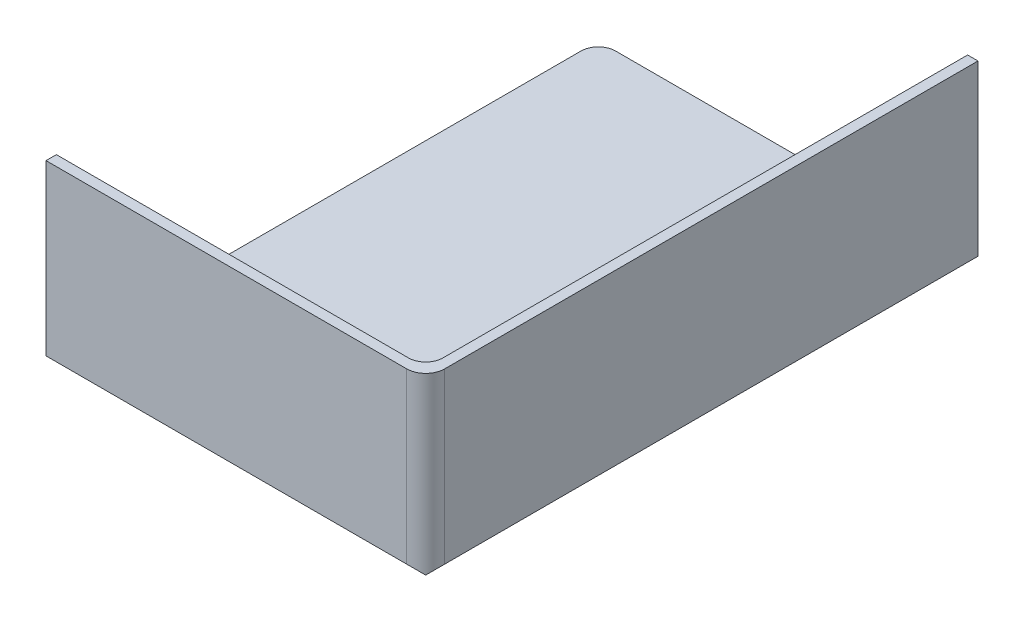
ISO-10303-21;
HEADER;
FILE_DESCRIPTION(('STEP AP214'),'2;1');
FILE_NAME('part.step','',(''),(''),'','','');
FILE_SCHEMA(('AUTOMOTIVE_DESIGN { 1 0 10303 214 1 1 1 1 }'));
ENDSEC;
DATA;
#1=APPLICATION_CONTEXT('core data for automotive mechanical design processes');
#2=APPLICATION_PROTOCOL_DEFINITION('international standard','automotive_design',2000,#1);
#3=PRODUCT_CONTEXT('',#1,'mechanical');
#4=PRODUCT('Part','Part','',(#3));
#5=PRODUCT_RELATED_PRODUCT_CATEGORY('part','',(#4));
#6=PRODUCT_DEFINITION_FORMATION('','',#4);
#7=PRODUCT_DEFINITION_CONTEXT('part definition',#1,'design');
#8=PRODUCT_DEFINITION('design','',#6,#7);
#9=PRODUCT_DEFINITION_SHAPE('','',#8);
#10=(LENGTH_UNIT() NAMED_UNIT(*) SI_UNIT(.MILLI.,.METRE.));
#11=(NAMED_UNIT(*) PLANE_ANGLE_UNIT() SI_UNIT($,.RADIAN.));
#12=(NAMED_UNIT(*) SI_UNIT($,.STERADIAN.) SOLID_ANGLE_UNIT());
#13=UNCERTAINTY_MEASURE_WITH_UNIT(LENGTH_MEASURE(1.E-05),#10,'distance_accuracy_value','');
#14=(GEOMETRIC_REPRESENTATION_CONTEXT(3) GLOBAL_UNCERTAINTY_ASSIGNED_CONTEXT((#13)) GLOBAL_UNIT_ASSIGNED_CONTEXT((#10,
#11,#12)) REPRESENTATION_CONTEXT('',''));
#15=CARTESIAN_POINT('',(0.,0.,0.));
#16=DIRECTION('',(0.,0.,1.));
#17=DIRECTION('',(1.,0.,0.));
#18=AXIS2_PLACEMENT_3D('',#15,#16,#17);
#19=CARTESIAN_POINT('',(0.,3.,0.));
#20=DIRECTION('',(0.,-1.,0.));
#21=DIRECTION('',(0.,0.,-1.));
#22=AXIS2_PLACEMENT_3D('',#19,#20,#21);
#23=PLANE('',#22);
#24=DIRECTION('',(-1.,0.,0.));
#25=VECTOR('',#24,1.);
#26=CARTESIAN_POINT('',(0.,3.,-160.));
#27=LINE('',#26,#25);
#28=CARTESIAN_POINT('',(102.,3.,-160.));
#29=VERTEX_POINT('',#28);
#30=CARTESIAN_POINT('',(5.,3.,-160.));
#31=VERTEX_POINT('',#30);
#32=EDGE_CURVE('E178',#29,#31,#27,.T.);
#33=ORIENTED_EDGE('',*,*,#32,.T.);
#34=CARTESIAN_POINT('',(5.,3.,-155.));
#35=DIRECTION('',(0.,-1.,0.));
#36=DIRECTION('',(0.,0.,-1.));
#37=AXIS2_PLACEMENT_3D('',#34,#35,#36);
#38=CIRCLE('',#37,5.);
#39=CARTESIAN_POINT('',(0.,3.,-155.));
#40=VERTEX_POINT('',#39);
#41=EDGE_CURVE('E220',#31,#40,#38,.F.);
#42=ORIENTED_EDGE('',*,*,#41,.T.);
#43=DIRECTION('',(0.,0.,1.));
#44=VECTOR('',#43,1.);
#45=CARTESIAN_POINT('',(0.,3.,0.));
#46=LINE('',#45,#44);
#47=CARTESIAN_POINT('',(0.,3.,-8.));
#48=VERTEX_POINT('',#47);
#49=EDGE_CURVE('E176',#40,#48,#46,.T.);
#50=ORIENTED_EDGE('',*,*,#49,.T.);
#51=DIRECTION('',(-1.,0.,0.));
#52=VECTOR('',#51,1.);
#53=CARTESIAN_POINT('',(107.,3.,-8.));
#54=LINE('',#53,#52);
#55=CARTESIAN_POINT('',(102.,3.,-8.));
#56=VERTEX_POINT('',#55);
#57=EDGE_CURVE('E190',#48,#56,#54,.F.);
#58=ORIENTED_EDGE('',*,*,#57,.T.);
#59=DIRECTION('',(0.,0.,1.));
#60=VECTOR('',#59,1.);
#61=CARTESIAN_POINT('',(102.,3.,-160.));
#62=LINE('',#61,#60);
#63=EDGE_CURVE('E188',#56,#29,#62,.F.);
#64=ORIENTED_EDGE('',*,*,#63,.T.);
#65=EDGE_LOOP('',(#33,#42,#50,#58,#64));
#66=FACE_BOUND('',#65,.T.);
#67=ADVANCED_FACE('F38',(#66),#23,.F.);
#68=CARTESIAN_POINT('',(0.,3.,0.));
#69=DIRECTION('',(1.,0.,0.));
#70=DIRECTION('',(0.,0.,-1.));
#71=AXIS2_PLACEMENT_3D('',#68,#69,#70);
#72=PLANE('',#71);
#73=ORIENTED_EDGE('',*,*,#49,.F.);
#74=DIRECTION('',(0.,-1.,0.));
#75=VECTOR('',#74,1.);
#76=CARTESIAN_POINT('',(0.,3.,-155.));
#77=LINE('',#76,#75);
#78=CARTESIAN_POINT('',(0.,0.,-155.));
#79=VERTEX_POINT('',#78);
#80=EDGE_CURVE('E212',#40,#79,#77,.T.);
#81=ORIENTED_EDGE('',*,*,#80,.T.);
#82=DIRECTION('',(0.,0.,1.));
#83=VECTOR('',#82,1.);
#84=CARTESIAN_POINT('',(0.,0.,0.));
#85=LINE('',#84,#83);
#86=CARTESIAN_POINT('',(0.,0.,-4.00000000000003));
#87=VERTEX_POINT('',#86);
#88=EDGE_CURVE('E175',#79,#87,#85,.T.);
#89=ORIENTED_EDGE('',*,*,#88,.T.);
#90=DIRECTION('',(0.,0.707106781186548,0.707106781186548));
#91=VECTOR('',#90,1.);
#92=CARTESIAN_POINT('',(0.,4.00000000000003,0.));
#93=LINE('',#92,#91);
#94=CARTESIAN_POINT('',(0.,4.00000000000003,0.));
#95=VERTEX_POINT('',#94);
#96=EDGE_CURVE('E144',#87,#95,#93,.T.);
#97=ORIENTED_EDGE('',*,*,#96,.T.);
#98=DIRECTION('',(0.,-1.,0.));
#99=VECTOR('',#98,1.);
#100=CARTESIAN_POINT('',(0.,3.,0.));
#101=LINE('',#100,#99);
#102=CARTESIAN_POINT('',(0.,53.,0.));
#103=VERTEX_POINT('',#102);
#104=EDGE_CURVE('E137',#103,#95,#101,.T.);
#105=ORIENTED_EDGE('',*,*,#104,.F.);
#106=DIRECTION('',(0.,0.,1.));
#107=VECTOR('',#106,1.);
#108=CARTESIAN_POINT('',(0.,53.,0.));
#109=LINE('',#108,#107);
#110=CARTESIAN_POINT('',(0.,53.,-3.));
#111=VERTEX_POINT('',#110);
#112=EDGE_CURVE('E142',#111,#103,#109,.T.);
#113=ORIENTED_EDGE('',*,*,#112,.F.);
#114=DIRECTION('',(0.,-1.,0.));
#115=VECTOR('',#114,1.);
#116=CARTESIAN_POINT('',(0.,53.,-3.));
#117=LINE('',#116,#115);
#118=CARTESIAN_POINT('',(0.,8.,-3.));
#119=VERTEX_POINT('',#118);
#120=EDGE_CURVE('E170',#111,#119,#117,.T.);
#121=ORIENTED_EDGE('',*,*,#120,.T.);
#122=CARTESIAN_POINT('',(0.,8.,-8.));
#123=DIRECTION('',(1.,0.,0.));
#124=DIRECTION('',(0.,0.,-1.));
#125=AXIS2_PLACEMENT_3D('',#122,#123,#124);
#126=CIRCLE('',#125,5.);
#127=EDGE_CURVE('E196',#119,#48,#126,.T.);
#128=ORIENTED_EDGE('',*,*,#127,.T.);
#129=EDGE_LOOP('',(#73,#81,#89,#97,#105,#113,#121,#128));
#130=FACE_BOUND('',#129,.T.);
#131=ADVANCED_FACE('F139',(#130),#72,.F.);
#132=CARTESIAN_POINT('',(0.,3.,0.));
#133=DIRECTION('',(0.,0.,-1.));
#134=DIRECTION('',(-1.,0.,0.));
#135=AXIS2_PLACEMENT_3D('',#132,#133,#134);
#136=PLANE('',#135);
#137=DIRECTION('',(1.,0.,0.));
#138=VECTOR('',#137,1.);
#139=CARTESIAN_POINT('',(110.,4.00000000000003,0.));
#140=LINE('',#139,#138);
#141=CARTESIAN_POINT('',(104.5,4.00000000000003,0.));
#142=VERTEX_POINT('',#141);
#143=EDGE_CURVE('E201',#95,#142,#140,.T.);
#144=ORIENTED_EDGE('',*,*,#143,.T.);
#145=DIRECTION('',(0.,-1.,0.));
#146=VECTOR('',#145,1.);
#147=CARTESIAN_POINT('',(104.5,3.,0.));
#148=LINE('',#147,#146);
#149=CARTESIAN_POINT('',(104.5,53.,0.));
#150=VERTEX_POINT('',#149);
#151=EDGE_CURVE('E46',#142,#150,#148,.F.);
#152=ORIENTED_EDGE('',*,*,#151,.T.);
#153=DIRECTION('',(1.,0.,0.));
#154=VECTOR('',#153,1.);
#155=CARTESIAN_POINT('',(0.,53.,0.));
#156=LINE('',#155,#154);
#157=EDGE_CURVE('E148',#103,#150,#156,.T.);
#158=ORIENTED_EDGE('',*,*,#157,.F.);
#159=ORIENTED_EDGE('',*,*,#104,.T.);
#160=EDGE_LOOP('',(#144,#152,#158,#159));
#161=FACE_BOUND('',#160,.T.);
#162=ADVANCED_FACE('F149',(#161),#136,.F.);
#163=CARTESIAN_POINT('',(110.,3.,0.));
#164=DIRECTION('',(-1.,0.,0.));
#165=DIRECTION('',(0.,0.,1.));
#166=AXIS2_PLACEMENT_3D('',#163,#164,#165);
#167=PLANE('',#166);
#168=DIRECTION('',(0.,0.,-1.));
#169=VECTOR('',#168,1.);
#170=CARTESIAN_POINT('',(110.,53.,0.));
#171=LINE('',#170,#169);
#172=CARTESIAN_POINT('',(110.,53.,-5.5));
#173=VERTEX_POINT('',#172);
#174=CARTESIAN_POINT('',(110.,53.,-160.));
#175=VERTEX_POINT('',#174);
#176=EDGE_CURVE('E152',#173,#175,#171,.T.);
#177=ORIENTED_EDGE('',*,*,#176,.F.);
#178=DIRECTION('',(0.,-1.,0.));
#179=VECTOR('',#178,1.);
#180=CARTESIAN_POINT('',(110.,3.,-5.5));
#181=LINE('',#180,#179);
#182=CARTESIAN_POINT('',(110.,4.00000000000003,-5.50000000000001));
#183=VERTEX_POINT('',#182);
#184=EDGE_CURVE('E233',#173,#183,#181,.T.);
#185=ORIENTED_EDGE('',*,*,#184,.T.);
#186=DIRECTION('',(0.,0.,-1.));
#187=VECTOR('',#186,1.);
#188=CARTESIAN_POINT('',(110.,4.00000000000003,-160.));
#189=LINE('',#188,#187);
#190=CARTESIAN_POINT('',(110.,4.00000000000003,-160.));
#191=VERTEX_POINT('',#190);
#192=EDGE_CURVE('E209',#183,#191,#189,.T.);
#193=ORIENTED_EDGE('',*,*,#192,.T.);
#194=DIRECTION('',(0.,-1.,0.));
#195=VECTOR('',#194,1.);
#196=CARTESIAN_POINT('',(110.,3.,-160.));
#197=LINE('',#196,#195);
#198=EDGE_CURVE('E146',#175,#191,#197,.T.);
#199=ORIENTED_EDGE('',*,*,#198,.F.);
#200=EDGE_LOOP('',(#177,#185,#193,#199));
#201=FACE_BOUND('',#200,.T.);
#202=ADVANCED_FACE('F253',(#201),#167,.F.);
#203=CARTESIAN_POINT('',(0.,3.,-160.));
#204=DIRECTION('',(0.,0.,1.));
#205=DIRECTION('',(1.,0.,0.));
#206=AXIS2_PLACEMENT_3D('',#203,#204,#205);
#207=PLANE('',#206);
#208=DIRECTION('',(-1.,0.,0.));
#209=VECTOR('',#208,1.);
#210=CARTESIAN_POINT('',(0.,0.,-160.));
#211=LINE('',#210,#209);
#212=CARTESIAN_POINT('',(106.,0.,-160.));
#213=VERTEX_POINT('',#212);
#214=CARTESIAN_POINT('',(5.,0.,-160.));
#215=VERTEX_POINT('',#214);
#216=EDGE_CURVE('E179',#213,#215,#211,.T.);
#217=ORIENTED_EDGE('',*,*,#216,.T.);
#218=DIRECTION('',(0.,-1.,0.));
#219=VECTOR('',#218,1.);
#220=CARTESIAN_POINT('',(5.,3.,-160.));
#221=LINE('',#220,#219);
#222=EDGE_CURVE('E218',#215,#31,#221,.F.);
#223=ORIENTED_EDGE('',*,*,#222,.T.);
#224=ORIENTED_EDGE('',*,*,#32,.F.);
#225=CARTESIAN_POINT('',(102.,8.,-160.));
#226=DIRECTION('',(0.,0.,1.));
#227=DIRECTION('',(1.,0.,0.));
#228=AXIS2_PLACEMENT_3D('',#225,#226,#227);
#229=CIRCLE('',#228,5.);
#230=CARTESIAN_POINT('',(107.,8.,-160.));
#231=VERTEX_POINT('',#230);
#232=EDGE_CURVE('E199',#29,#231,#229,.T.);
#233=ORIENTED_EDGE('',*,*,#232,.T.);
#234=DIRECTION('',(0.,-1.,0.));
#235=VECTOR('',#234,1.);
#236=CARTESIAN_POINT('',(107.,53.,-160.));
#237=LINE('',#236,#235);
#238=CARTESIAN_POINT('',(107.,53.,-160.));
#239=VERTEX_POINT('',#238);
#240=EDGE_CURVE('E172',#239,#231,#237,.T.);
#241=ORIENTED_EDGE('',*,*,#240,.F.);
#242=DIRECTION('',(-1.,0.,0.));
#243=VECTOR('',#242,1.);
#244=CARTESIAN_POINT('',(110.,53.,-160.));
#245=LINE('',#244,#243);
#246=EDGE_CURVE('E164',#175,#239,#245,.T.);
#247=ORIENTED_EDGE('',*,*,#246,.F.);
#248=ORIENTED_EDGE('',*,*,#198,.T.);
#249=DIRECTION('',(-0.707106781186548,-0.707106781186548,0.));
#250=VECTOR('',#249,1.);
#251=CARTESIAN_POINT('',(110.,4.00000000000003,-160.));
#252=LINE('',#251,#250);
#253=EDGE_CURVE('E211',#191,#213,#252,.T.);
#254=ORIENTED_EDGE('',*,*,#253,.T.);
#255=EDGE_LOOP('',(#217,#223,#224,#233,#241,#247,#248,#254));
#256=FACE_BOUND('',#255,.T.);
#257=ADVANCED_FACE('F257',(#256),#207,.F.);
#258=CARTESIAN_POINT('',(0.,0.,0.));
#259=DIRECTION('',(0.,-1.,0.));
#260=DIRECTION('',(0.,0.,-1.));
#261=AXIS2_PLACEMENT_3D('',#258,#259,#260);
#262=PLANE('',#261);
#263=ORIENTED_EDGE('',*,*,#88,.F.);
#264=CARTESIAN_POINT('',(5.,0.,-155.));
#265=DIRECTION('',(0.,-1.,0.));
#266=DIRECTION('',(0.,0.,-1.));
#267=AXIS2_PLACEMENT_3D('',#264,#265,#266);
#268=CIRCLE('',#267,5.);
#269=EDGE_CURVE('E216',#79,#215,#268,.T.);
#270=ORIENTED_EDGE('',*,*,#269,.T.);
#271=ORIENTED_EDGE('',*,*,#216,.F.);
#272=DIRECTION('',(0.,0.,1.));
#273=VECTOR('',#272,1.);
#274=CARTESIAN_POINT('',(106.,0.,0.));
#275=LINE('',#274,#273);
#276=CARTESIAN_POINT('',(106.,0.,-4.00000000000003));
#277=VERTEX_POINT('',#276);
#278=EDGE_CURVE('E203',#213,#277,#275,.T.);
#279=ORIENTED_EDGE('',*,*,#278,.T.);
#280=DIRECTION('',(-1.,0.,0.));
#281=VECTOR('',#280,1.);
#282=CARTESIAN_POINT('',(0.,0.,-4.00000000000003));
#283=LINE('',#282,#281);
#284=EDGE_CURVE('E205',#277,#87,#283,.T.);
#285=ORIENTED_EDGE('',*,*,#284,.T.);
#286=EDGE_LOOP('',(#263,#270,#271,#279,#285));
#287=FACE_BOUND('',#286,.T.);
#288=ADVANCED_FACE('F283',(#287),#262,.T.);
#289=CARTESIAN_POINT('',(107.,53.,-3.));
#290=DIRECTION('',(1.,0.,0.));
#291=DIRECTION('',(0.,0.,-1.));
#292=AXIS2_PLACEMENT_3D('',#289,#290,#291);
#293=PLANE('',#292);
#294=DIRECTION('',(0.,0.,1.));
#295=VECTOR('',#294,1.);
#296=CARTESIAN_POINT('',(107.,8.,-3.));
#297=LINE('',#296,#295);
#298=CARTESIAN_POINT('',(107.,8.,-8.));
#299=VERTEX_POINT('',#298);
#300=EDGE_CURVE('E193',#231,#299,#297,.T.);
#301=ORIENTED_EDGE('',*,*,#300,.T.);
#302=DIRECTION('',(0.,-1.,0.));
#303=VECTOR('',#302,1.);
#304=CARTESIAN_POINT('',(107.,53.,-8.));
#305=LINE('',#304,#303);
#306=CARTESIAN_POINT('',(107.,53.,-8.));
#307=VERTEX_POINT('',#306);
#308=EDGE_CURVE('E229',#299,#307,#305,.F.);
#309=ORIENTED_EDGE('',*,*,#308,.T.);
#310=DIRECTION('',(0.,0.,1.));
#311=VECTOR('',#310,1.);
#312=CARTESIAN_POINT('',(107.,53.,-3.));
#313=LINE('',#312,#311);
#314=EDGE_CURVE('E166',#239,#307,#313,.T.);
#315=ORIENTED_EDGE('',*,*,#314,.F.);
#316=ORIENTED_EDGE('',*,*,#240,.T.);
#317=EDGE_LOOP('',(#301,#309,#315,#316));
#318=FACE_BOUND('',#317,.T.);
#319=ADVANCED_FACE('F290',(#318),#293,.F.);
#320=CARTESIAN_POINT('',(0.,53.,-3.));
#321=DIRECTION('',(0.,0.,1.));
#322=DIRECTION('',(1.,0.,0.));
#323=AXIS2_PLACEMENT_3D('',#320,#321,#322);
#324=PLANE('',#323);
#325=DIRECTION('',(-1.,0.,0.));
#326=VECTOR('',#325,1.);
#327=CARTESIAN_POINT('',(0.,53.,-3.));
#328=LINE('',#327,#326);
#329=CARTESIAN_POINT('',(102.,53.,-3.));
#330=VERTEX_POINT('',#329);
#331=EDGE_CURVE('E156',#330,#111,#328,.T.);
#332=ORIENTED_EDGE('',*,*,#331,.F.);
#333=DIRECTION('',(0.,-1.,0.));
#334=VECTOR('',#333,1.);
#335=CARTESIAN_POINT('',(102.,8.,-3.));
#336=LINE('',#335,#334);
#337=CARTESIAN_POINT('',(102.,8.,-3.));
#338=VERTEX_POINT('',#337);
#339=EDGE_CURVE('E227',#330,#338,#336,.T.);
#340=ORIENTED_EDGE('',*,*,#339,.T.);
#341=DIRECTION('',(-1.,0.,0.));
#342=VECTOR('',#341,1.);
#343=CARTESIAN_POINT('',(0.,8.,-3.));
#344=LINE('',#343,#342);
#345=EDGE_CURVE('E145',#338,#119,#344,.T.);
#346=ORIENTED_EDGE('',*,*,#345,.T.);
#347=ORIENTED_EDGE('',*,*,#120,.F.);
#348=EDGE_LOOP('',(#332,#340,#346,#347));
#349=FACE_BOUND('',#348,.T.);
#350=ADVANCED_FACE('F269',(#349),#324,.F.);
#351=CARTESIAN_POINT('',(0.,53.,0.));
#352=DIRECTION('',(0.,-1.,0.));
#353=DIRECTION('',(0.,0.,-1.));
#354=AXIS2_PLACEMENT_3D('',#351,#352,#353);
#355=PLANE('',#354);
#356=ORIENTED_EDGE('',*,*,#157,.T.);
#357=CARTESIAN_POINT('',(104.5,53.,-5.5));
#358=DIRECTION('',(0.,-1.,0.));
#359=DIRECTION('',(0.,0.,-1.));
#360=AXIS2_PLACEMENT_3D('',#357,#358,#359);
#361=CIRCLE('',#360,5.5);
#362=EDGE_CURVE('E11',#150,#173,#361,.F.);
#363=ORIENTED_EDGE('',*,*,#362,.T.);
#364=ORIENTED_EDGE('',*,*,#176,.T.);
#365=ORIENTED_EDGE('',*,*,#246,.T.);
#366=ORIENTED_EDGE('',*,*,#314,.T.);
#367=CARTESIAN_POINT('',(102.,53.,-8.));
#368=DIRECTION('',(0.,-1.,0.));
#369=DIRECTION('',(0.,0.,-1.));
#370=AXIS2_PLACEMENT_3D('',#367,#368,#369);
#371=CIRCLE('',#370,5.);
#372=EDGE_CURVE('E231',#307,#330,#371,.T.);
#373=ORIENTED_EDGE('',*,*,#372,.T.);
#374=ORIENTED_EDGE('',*,*,#331,.T.);
#375=ORIENTED_EDGE('',*,*,#112,.T.);
#376=EDGE_LOOP('',(#356,#363,#364,#365,#366,#373,#374,#375));
#377=FACE_BOUND('',#376,.T.);
#378=ADVANCED_FACE('F154',(#377),#355,.F.);
#379=CARTESIAN_POINT('',(102.,8.,-3.));
#380=DIRECTION('',(0.,0.,-1.));
#381=DIRECTION('',(-1.,0.,0.));
#382=AXIS2_PLACEMENT_3D('',#379,#380,#381);
#383=CYLINDRICAL_SURFACE('',#382,5.);
#384=ORIENTED_EDGE('',*,*,#63,.F.);
#385=CARTESIAN_POINT('',(102.,8.,-8.));
#386=DIRECTION('',(0.,0.,-1.));
#387=DIRECTION('',(-1.,0.,0.));
#388=AXIS2_PLACEMENT_3D('',#385,#386,#387);
#389=CIRCLE('',#388,5.);
#390=EDGE_CURVE('E225',#56,#299,#389,.F.);
#391=ORIENTED_EDGE('',*,*,#390,.T.);
#392=ORIENTED_EDGE('',*,*,#300,.F.);
#393=ORIENTED_EDGE('',*,*,#232,.F.);
#394=EDGE_LOOP('',(#384,#391,#392,#393));
#395=FACE_BOUND('',#394,.T.);
#396=ADVANCED_FACE('F288',(#395),#383,.F.);
#397=CARTESIAN_POINT('',(0.,8.,-8.));
#398=DIRECTION('',(1.,0.,0.));
#399=DIRECTION('',(0.,0.,-1.));
#400=AXIS2_PLACEMENT_3D('',#397,#398,#399);
#401=CYLINDRICAL_SURFACE('',#400,5.);
#402=ORIENTED_EDGE('',*,*,#345,.F.);
#403=CARTESIAN_POINT('',(102.,8.,-8.));
#404=DIRECTION('',(1.,0.,0.));
#405=DIRECTION('',(0.,0.,-1.));
#406=AXIS2_PLACEMENT_3D('',#403,#404,#405);
#407=CIRCLE('',#406,5.);
#408=EDGE_CURVE('E222',#338,#56,#407,.T.);
#409=ORIENTED_EDGE('',*,*,#408,.T.);
#410=ORIENTED_EDGE('',*,*,#57,.F.);
#411=ORIENTED_EDGE('',*,*,#127,.F.);
#412=EDGE_LOOP('',(#402,#409,#410,#411));
#413=FACE_BOUND('',#412,.T.);
#414=ADVANCED_FACE('F272',(#413),#401,.F.);
#415=CARTESIAN_POINT('',(110.,4.00000000000003,0.));
#416=DIRECTION('',(0.707106781186547,-0.707106781186547,0.));
#417=DIRECTION('',(0.,0.,1.));
#418=AXIS2_PLACEMENT_3D('',#415,#416,#417);
#419=PLANE('',#418);
#420=ORIENTED_EDGE('',*,*,#192,.F.);
#421=CARTESIAN_POINT('',(104.5,-1.49999999999997,-5.5));
#422=DIRECTION('',(0.707106781186547,-0.707106781186547,0.));
#423=DIRECTION('',(-0.707106781186548,-0.707106781186548,0.));
#424=AXIS2_PLACEMENT_3D('',#421,#422,#423);
#425=ELLIPSE('',#424,7.77817459305202,5.5);
#426=CARTESIAN_POINT('',(108.389087296526,2.38908729652604,-1.61091270347399));
#427=VERTEX_POINT('',#426);
#428=EDGE_CURVE('E238',#183,#427,#425,.T.);
#429=ORIENTED_EDGE('',*,*,#428,.T.);
#430=DIRECTION('',(-0.577350269189626,-0.577350269189626,-0.577350269189626));
#431=VECTOR('',#430,1.);
#432=CARTESIAN_POINT('',(110.,4.00000000000003,0.));
#433=LINE('',#432,#431);
#434=EDGE_CURVE('E158',#277,#427,#433,.F.);
#435=ORIENTED_EDGE('',*,*,#434,.F.);
#436=ORIENTED_EDGE('',*,*,#278,.F.);
#437=ORIENTED_EDGE('',*,*,#253,.F.);
#438=EDGE_LOOP('',(#420,#429,#435,#436,#437));
#439=FACE_BOUND('',#438,.T.);
#440=ADVANCED_FACE('F243',(#439),#419,.T.);
#441=CARTESIAN_POINT('',(0.,4.00000000000003,0.));
#442=DIRECTION('',(0.,-0.707106781186547,0.707106781186547));
#443=DIRECTION('',(-1.,0.,0.));
#444=AXIS2_PLACEMENT_3D('',#441,#442,#443);
#445=PLANE('',#444);
#446=ORIENTED_EDGE('',*,*,#434,.T.);
#447=CARTESIAN_POINT('',(104.5,-1.49999999999997,-5.5));
#448=DIRECTION('',(0.,-0.707106781186547,0.707106781186547));
#449=DIRECTION('',(0.,-0.707106781186548,-0.707106781186548));
#450=AXIS2_PLACEMENT_3D('',#447,#448,#449);
#451=ELLIPSE('',#450,7.77817459305202,5.5);
#452=EDGE_CURVE('E60',#427,#142,#451,.T.);
#453=ORIENTED_EDGE('',*,*,#452,.T.);
#454=ORIENTED_EDGE('',*,*,#143,.F.);
#455=ORIENTED_EDGE('',*,*,#96,.F.);
#456=ORIENTED_EDGE('',*,*,#284,.F.);
#457=EDGE_LOOP('',(#446,#453,#454,#455,#456));
#458=FACE_BOUND('',#457,.T.);
#459=ADVANCED_FACE('F249',(#458),#445,.T.);
#460=CARTESIAN_POINT('',(5.,3.,-155.));
#461=DIRECTION('',(0.,-1.,0.));
#462=DIRECTION('',(0.,0.,-1.));
#463=AXIS2_PLACEMENT_3D('',#460,#461,#462);
#464=CYLINDRICAL_SURFACE('',#463,5.);
#465=ORIENTED_EDGE('',*,*,#41,.F.);
#466=ORIENTED_EDGE('',*,*,#222,.F.);
#467=ORIENTED_EDGE('',*,*,#269,.F.);
#468=ORIENTED_EDGE('',*,*,#80,.F.);
#469=EDGE_LOOP('',(#465,#466,#467,#468));
#470=FACE_BOUND('',#469,.T.);
#471=ADVANCED_FACE('F279',(#470),#464,.T.);
#472=CARTESIAN_POINT('',(102.,53.,-8.));
#473=DIRECTION('',(0.,1.,0.));
#474=DIRECTION('',(0.,0.,1.));
#475=AXIS2_PLACEMENT_3D('',#472,#473,#474);
#476=CYLINDRICAL_SURFACE('',#475,5.);
#477=ORIENTED_EDGE('',*,*,#372,.F.);
#478=ORIENTED_EDGE('',*,*,#308,.F.);
#479=CARTESIAN_POINT('',(102.,8.,-8.));
#480=DIRECTION('',(0.,1.,0.));
#481=DIRECTION('',(0.,0.,1.));
#482=AXIS2_PLACEMENT_3D('',#479,#480,#481);
#483=CIRCLE('',#482,5.);
#484=EDGE_CURVE('E160',#338,#299,#483,.T.);
#485=ORIENTED_EDGE('',*,*,#484,.F.);
#486=ORIENTED_EDGE('',*,*,#339,.F.);
#487=EDGE_LOOP('',(#477,#478,#485,#486));
#488=FACE_BOUND('',#487,.T.);
#489=ADVANCED_FACE('F264',(#488),#476,.F.);
#490=CARTESIAN_POINT('',(102.,8.,-8.));
#491=DIRECTION('',(0.,0.,1.));
#492=DIRECTION('',(1.,0.,0.));
#493=AXIS2_PLACEMENT_3D('',#490,#491,#492);
#494=SPHERICAL_SURFACE('',#493,5.);
#495=ORIENTED_EDGE('',*,*,#484,.T.);
#496=ORIENTED_EDGE('',*,*,#390,.F.);
#497=ORIENTED_EDGE('',*,*,#408,.F.);
#498=EDGE_LOOP('',(#495,#496,#497));
#499=FACE_BOUND('',#498,.T.);
#500=ADVANCED_FACE('F328',(#499),#494,.F.);
#501=CARTESIAN_POINT('',(104.5,3.,-5.5));
#502=DIRECTION('',(0.,-1.,0.));
#503=DIRECTION('',(0.,0.,-1.));
#504=AXIS2_PLACEMENT_3D('',#501,#502,#503);
#505=CYLINDRICAL_SURFACE('',#504,5.5);
#506=ORIENTED_EDGE('',*,*,#362,.F.);
#507=ORIENTED_EDGE('',*,*,#151,.F.);
#508=ORIENTED_EDGE('',*,*,#452,.F.);
#509=ORIENTED_EDGE('',*,*,#428,.F.);
#510=ORIENTED_EDGE('',*,*,#184,.F.);
#511=EDGE_LOOP('',(#506,#507,#508,#509,#510));
#512=FACE_BOUND('',#511,.T.);
#513=ADVANCED_FACE('F40',(#512),#505,.T.);
#514=CLOSED_SHELL('',(#67,#131,#162,#202,#257,#288,#319,#350,#378,#396,#414,#440,#459,#471,#489,
#500,#513));
#515=MANIFOLD_SOLID_BREP('B2',#514);
#516=ADVANCED_BREP_SHAPE_REPRESENTATION('',(#18,#515),#14);
#517=SHAPE_DEFINITION_REPRESENTATION(#9,#516);
ENDSEC;
END-ISO-10303-21;
